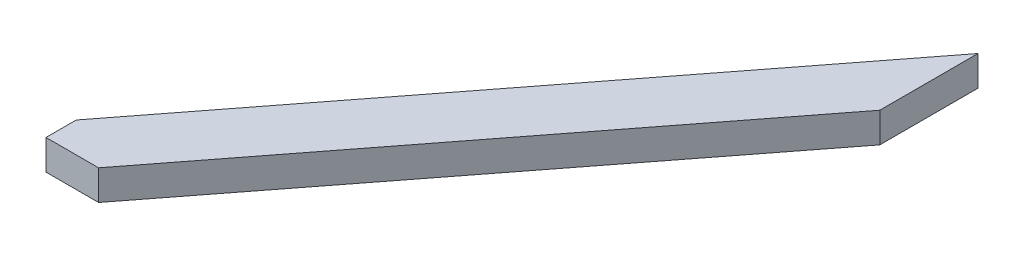
ISO-10303-21;
HEADER;
FILE_DESCRIPTION(('STEP AP214'),'2;1');
FILE_NAME('part.step','',(''),(''),'','','');
FILE_SCHEMA(('AUTOMOTIVE_DESIGN { 1 0 10303 214 1 1 1 1 }'));
ENDSEC;
DATA;
#1=APPLICATION_CONTEXT('core data for automotive mechanical design processes');
#2=APPLICATION_PROTOCOL_DEFINITION('international standard','automotive_design',2000,#1);
#3=PRODUCT_CONTEXT('',#1,'mechanical');
#4=PRODUCT('Part','Part','',(#3));
#5=PRODUCT_RELATED_PRODUCT_CATEGORY('part','',(#4));
#6=PRODUCT_DEFINITION_FORMATION('','',#4);
#7=PRODUCT_DEFINITION_CONTEXT('part definition',#1,'design');
#8=PRODUCT_DEFINITION('design','',#6,#7);
#9=PRODUCT_DEFINITION_SHAPE('','',#8);
#10=(LENGTH_UNIT() NAMED_UNIT(*) SI_UNIT(.MILLI.,.METRE.));
#11=(NAMED_UNIT(*) PLANE_ANGLE_UNIT() SI_UNIT($,.RADIAN.));
#12=(NAMED_UNIT(*) SI_UNIT($,.STERADIAN.) SOLID_ANGLE_UNIT());
#13=UNCERTAINTY_MEASURE_WITH_UNIT(LENGTH_MEASURE(1.E-05),#10,'distance_accuracy_value','');
#14=(GEOMETRIC_REPRESENTATION_CONTEXT(3) GLOBAL_UNCERTAINTY_ASSIGNED_CONTEXT((#13)) GLOBAL_UNIT_ASSIGNED_CONTEXT((#10,
#11,#12)) REPRESENTATION_CONTEXT('',''));
#15=CARTESIAN_POINT('',(0.,0.,0.));
#16=DIRECTION('',(0.,0.,1.));
#17=DIRECTION('',(1.,0.,0.));
#18=AXIS2_PLACEMENT_3D('',#15,#16,#17);
#19=CARTESIAN_POINT('',(664.999999999999,659.899999999995,1465.00000000001));
#20=DIRECTION('',(-1.,0.,0.));
#21=DIRECTION('',(0.,-1.,0.));
#22=AXIS2_PLACEMENT_3D('',#19,#20,#21);
#23=PLANE('',#22);
#24=DIRECTION('',(0.,0.,1.));
#25=VECTOR('',#24,1.);
#26=CARTESIAN_POINT('',(664.999999999999,710.699999999995,1465.00000000001));
#27=LINE('',#26,#25);
#28=CARTESIAN_POINT('',(664.999999999999,710.699999999995,1298.9403317477));
#29=VERTEX_POINT('',#28);
#30=CARTESIAN_POINT('',(664.999999999999,710.699999999995,1465.00000000001));
#31=VERTEX_POINT('',#30);
#32=EDGE_CURVE('E107',#29,#31,#27,.T.);
#33=ORIENTED_EDGE('',*,*,#32,.T.);
#34=DIRECTION('',(0.,1.,0.));
#35=VECTOR('',#34,1.);
#36=CARTESIAN_POINT('',(664.999999999999,659.899999999995,1465.00000000001));
#37=LINE('',#36,#35);
#38=CARTESIAN_POINT('',(664.999999999999,659.899999999995,1465.00000000001));
#39=VERTEX_POINT('',#38);
#40=EDGE_CURVE('E11',#39,#31,#37,.T.);
#41=ORIENTED_EDGE('',*,*,#40,.F.);
#42=DIRECTION('',(0.,0.,1.));
#43=VECTOR('',#42,1.);
#44=CARTESIAN_POINT('',(664.999999999999,659.899999999995,1465.00000000001));
#45=LINE('',#44,#43);
#46=CARTESIAN_POINT('',(664.999999999999,659.899999999995,1298.9403317477));
#47=VERTEX_POINT('',#46);
#48=EDGE_CURVE('E115',#47,#39,#45,.T.);
#49=ORIENTED_EDGE('',*,*,#48,.F.);
#50=DIRECTION('',(0.,1.,0.));
#51=VECTOR('',#50,1.);
#52=CARTESIAN_POINT('',(664.999999999999,659.899999999995,1298.9403317477));
#53=LINE('',#52,#51);
#54=EDGE_CURVE('E103',#47,#29,#53,.T.);
#55=ORIENTED_EDGE('',*,*,#54,.T.);
#56=EDGE_LOOP('',(#33,#41,#49,#55));
#57=FACE_BOUND('',#56,.T.);
#58=ADVANCED_FACE('F33',(#57),#23,.F.);
#59=CARTESIAN_POINT('',(88.900000000018,659.899999999997,2209.8));
#60=DIRECTION('',(-0.790990622362604,0.,-0.611828272748506));
#61=DIRECTION('',(-0.611828272748506,0.,0.790990622362604));
#62=AXIS2_PLACEMENT_3D('',#59,#60,#61);
#63=PLANE('',#62);
#64=DIRECTION('',(-0.611828272748506,0.,0.790990622362604));
#65=VECTOR('',#64,1.);
#66=CARTESIAN_POINT('',(88.9000000000181,710.699999999997,2209.8));
#67=LINE('',#66,#65);
#68=CARTESIAN_POINT('',(88.9000000000181,710.699999999997,2209.8));
#69=VERTEX_POINT('',#68);
#70=EDGE_CURVE('E110',#31,#69,#67,.T.);
#71=ORIENTED_EDGE('',*,*,#70,.T.);
#72=DIRECTION('',(0.,1.,0.));
#73=VECTOR('',#72,1.);
#74=CARTESIAN_POINT('',(88.900000000018,659.899999999997,2209.8));
#75=LINE('',#74,#73);
#76=CARTESIAN_POINT('',(88.900000000018,659.899999999997,2209.8));
#77=VERTEX_POINT('',#76);
#78=EDGE_CURVE('E41',#77,#69,#75,.T.);
#79=ORIENTED_EDGE('',*,*,#78,.F.);
#80=DIRECTION('',(-0.611828272748506,0.,0.790990622362604));
#81=VECTOR('',#80,1.);
#82=CARTESIAN_POINT('',(88.900000000018,659.899999999997,2209.8));
#83=LINE('',#82,#81);
#84=EDGE_CURVE('E83',#39,#77,#83,.T.);
#85=ORIENTED_EDGE('',*,*,#84,.F.);
#86=ORIENTED_EDGE('',*,*,#40,.T.);
#87=EDGE_LOOP('',(#71,#79,#85,#86));
#88=FACE_BOUND('',#87,.T.);
#89=ADVANCED_FACE('F134',(#88),#63,.F.);
#90=CARTESIAN_POINT('',(1.7965992104037E-11,659.899999999997,2209.8));
#91=DIRECTION('',(0.,0.,-1.));
#92=DIRECTION('',(0.,1.,0.));
#93=AXIS2_PLACEMENT_3D('',#90,#91,#92);
#94=PLANE('',#93);
#95=DIRECTION('',(-1.,0.,0.));
#96=VECTOR('',#95,1.);
#97=CARTESIAN_POINT('',(1.81044330206047E-11,710.699999999997,2209.8));
#98=LINE('',#97,#96);
#99=CARTESIAN_POINT('',(1.81044330206047E-11,710.699999999997,2209.8));
#100=VERTEX_POINT('',#99);
#101=EDGE_CURVE('E98',#69,#100,#98,.T.);
#102=ORIENTED_EDGE('',*,*,#101,.T.);
#103=DIRECTION('',(0.,1.,0.));
#104=VECTOR('',#103,1.);
#105=CARTESIAN_POINT('',(1.7965992104037E-11,659.899999999997,2209.8));
#106=LINE('',#105,#104);
#107=CARTESIAN_POINT('',(1.7965992104037E-11,659.899999999997,2209.8));
#108=VERTEX_POINT('',#107);
#109=EDGE_CURVE('E95',#108,#100,#106,.T.);
#110=ORIENTED_EDGE('',*,*,#109,.F.);
#111=DIRECTION('',(-1.,0.,0.));
#112=VECTOR('',#111,1.);
#113=CARTESIAN_POINT('',(1.7965992104037E-11,659.899999999997,2209.8));
#114=LINE('',#113,#112);
#115=EDGE_CURVE('E87',#77,#108,#114,.T.);
#116=ORIENTED_EDGE('',*,*,#115,.F.);
#117=ORIENTED_EDGE('',*,*,#78,.T.);
#118=EDGE_LOOP('',(#102,#110,#116,#117));
#119=FACE_BOUND('',#118,.T.);
#120=ADVANCED_FACE('F96',(#119),#94,.F.);
#121=CARTESIAN_POINT('',(1.7965992104037E-11,659.899999999997,2209.8));
#122=DIRECTION('',(1.,0.,-2.54879947895807E-13));
#123=DIRECTION('',(-2.54879947895807E-13,0.,-1.));
#124=AXIS2_PLACEMENT_3D('',#121,#122,#123);
#125=PLANE('',#124);
#126=DIRECTION('',(-2.54879947895807E-13,0.,-1.));
#127=VECTOR('',#126,1.);
#128=CARTESIAN_POINT('',(1.81044330206047E-11,710.699999999997,2209.8));
#129=LINE('',#128,#127);
#130=CARTESIAN_POINT('',(5.07319026906691E-12,710.699999999997,2158.6730170454));
#131=VERTEX_POINT('',#130);
#132=EDGE_CURVE('E69',#100,#131,#129,.T.);
#133=ORIENTED_EDGE('',*,*,#132,.T.);
#134=DIRECTION('',(0.,1.,0.));
#135=VECTOR('',#134,1.);
#136=CARTESIAN_POINT('',(4.93474935249924E-12,659.899999999997,2158.6730170454));
#137=LINE('',#136,#135);
#138=CARTESIAN_POINT('',(4.93474935249924E-12,659.899999999997,2158.6730170454));
#139=VERTEX_POINT('',#138);
#140=EDGE_CURVE('E99',#139,#131,#137,.T.);
#141=ORIENTED_EDGE('',*,*,#140,.F.);
#142=DIRECTION('',(-2.54879947895807E-13,0.,-1.));
#143=VECTOR('',#142,1.);
#144=CARTESIAN_POINT('',(1.7965992104037E-11,659.899999999997,2209.8));
#145=LINE('',#144,#143);
#146=EDGE_CURVE('E91',#108,#139,#145,.T.);
#147=ORIENTED_EDGE('',*,*,#146,.F.);
#148=ORIENTED_EDGE('',*,*,#109,.T.);
#149=EDGE_LOOP('',(#133,#141,#147,#148));
#150=FACE_BOUND('',#149,.T.);
#151=ADVANCED_FACE('F101',(#150),#125,.F.);
#152=CARTESIAN_POINT('',(664.999999999999,659.899999999995,1298.9403317477));
#153=DIRECTION('',(0.790990622362604,0.,0.611828272748506));
#154=DIRECTION('',(0.611828272748506,0.,-0.790990622362604));
#155=AXIS2_PLACEMENT_3D('',#152,#153,#154);
#156=PLANE('',#155);
#157=DIRECTION('',(0.611828272748506,0.,-0.790990622362604));
#158=VECTOR('',#157,1.);
#159=CARTESIAN_POINT('',(664.999999999999,710.699999999995,1298.9403317477));
#160=LINE('',#159,#158);
#161=EDGE_CURVE('E75',#131,#29,#160,.T.);
#162=ORIENTED_EDGE('',*,*,#161,.T.);
#163=ORIENTED_EDGE('',*,*,#54,.F.);
#164=DIRECTION('',(0.611828272748506,0.,-0.790990622362604));
#165=VECTOR('',#164,1.);
#166=CARTESIAN_POINT('',(664.999999999999,659.899999999995,1298.9403317477));
#167=LINE('',#166,#165);
#168=EDGE_CURVE('E49',#139,#47,#167,.T.);
#169=ORIENTED_EDGE('',*,*,#168,.F.);
#170=ORIENTED_EDGE('',*,*,#140,.T.);
#171=EDGE_LOOP('',(#162,#163,#169,#170));
#172=FACE_BOUND('',#171,.T.);
#173=ADVANCED_FACE('F123',(#172),#156,.F.);
#174=CARTESIAN_POINT('',(1.63666707803547E-12,659.899999999997,0.));
#175=DIRECTION('',(0.,-1.,0.));
#176=DIRECTION('',(1.,0.,0.));
#177=AXIS2_PLACEMENT_3D('',#174,#175,#176);
#178=PLANE('',#177);
#179=ORIENTED_EDGE('',*,*,#48,.T.);
#180=ORIENTED_EDGE('',*,*,#84,.T.);
#181=ORIENTED_EDGE('',*,*,#115,.T.);
#182=ORIENTED_EDGE('',*,*,#146,.T.);
#183=ORIENTED_EDGE('',*,*,#168,.T.);
#184=EDGE_LOOP('',(#179,#180,#181,#182,#183));
#185=FACE_BOUND('',#184,.T.);
#186=ADVANCED_FACE('F89',(#185),#178,.T.);
#187=CARTESIAN_POINT('',(1.77510799460314E-12,710.699999999997,0.));
#188=DIRECTION('',(0.,-1.,0.));
#189=DIRECTION('',(1.,0.,0.));
#190=AXIS2_PLACEMENT_3D('',#187,#188,#189);
#191=PLANE('',#190);
#192=ORIENTED_EDGE('',*,*,#32,.F.);
#193=ORIENTED_EDGE('',*,*,#161,.F.);
#194=ORIENTED_EDGE('',*,*,#132,.F.);
#195=ORIENTED_EDGE('',*,*,#101,.F.);
#196=ORIENTED_EDGE('',*,*,#70,.F.);
#197=EDGE_LOOP('',(#192,#193,#194,#195,#196));
#198=FACE_BOUND('',#197,.T.);
#199=ADVANCED_FACE('F119',(#198),#191,.F.);
#200=CLOSED_SHELL('',(#58,#89,#120,#151,#173,#186,#199));
#201=MANIFOLD_SOLID_BREP('B2',#200);
#202=ADVANCED_BREP_SHAPE_REPRESENTATION('',(#18,#201),#14);
#203=SHAPE_DEFINITION_REPRESENTATION(#9,#202);
ENDSEC;
END-ISO-10303-21;
